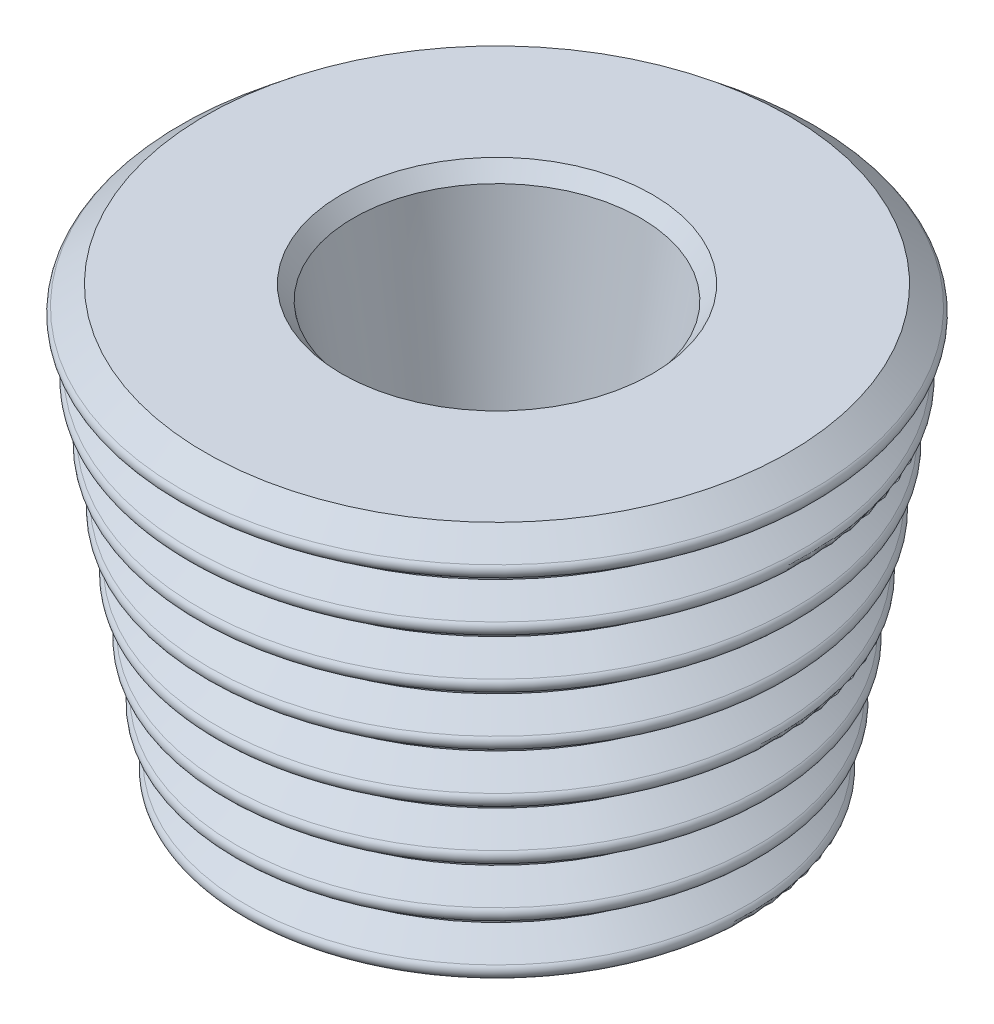
ISO-10303-21;
HEADER;
FILE_DESCRIPTION(('STEP AP214'),'2;1');
FILE_NAME('part.step','',(''),(''),'','','');
FILE_SCHEMA(('AUTOMOTIVE_DESIGN { 1 0 10303 214 1 1 1 1 }'));
ENDSEC;
DATA;
#1=APPLICATION_CONTEXT('core data for automotive mechanical design processes');
#2=APPLICATION_PROTOCOL_DEFINITION('international standard','automotive_design',2000,#1);
#3=PRODUCT_CONTEXT('',#1,'mechanical');
#4=PRODUCT('Part','Part','',(#3));
#5=PRODUCT_RELATED_PRODUCT_CATEGORY('part','',(#4));
#6=PRODUCT_DEFINITION_FORMATION('','',#4);
#7=PRODUCT_DEFINITION_CONTEXT('part definition',#1,'design');
#8=PRODUCT_DEFINITION('design','',#6,#7);
#9=PRODUCT_DEFINITION_SHAPE('','',#8);
#10=(LENGTH_UNIT() NAMED_UNIT(*) SI_UNIT(.MILLI.,.METRE.));
#11=(NAMED_UNIT(*) PLANE_ANGLE_UNIT() SI_UNIT($,.RADIAN.));
#12=(NAMED_UNIT(*) SI_UNIT($,.STERADIAN.) SOLID_ANGLE_UNIT());
#13=UNCERTAINTY_MEASURE_WITH_UNIT(LENGTH_MEASURE(1.E-05),#10,'distance_accuracy_value','');
#14=(GEOMETRIC_REPRESENTATION_CONTEXT(3) GLOBAL_UNCERTAINTY_ASSIGNED_CONTEXT((#13)) GLOBAL_UNIT_ASSIGNED_CONTEXT((#10,
#11,#12)) REPRESENTATION_CONTEXT('',''));
#15=CARTESIAN_POINT('',(0.,0.,0.));
#16=DIRECTION('',(0.,0.,1.));
#17=DIRECTION('',(1.,0.,0.));
#18=AXIS2_PLACEMENT_3D('',#15,#16,#17);
#19=CARTESIAN_POINT('',(0.,15.,0.));
#20=DIRECTION('',(0.,-1.,0.));
#21=DIRECTION('',(0.,0.,-1.));
#22=AXIS2_PLACEMENT_3D('',#19,#20,#21);
#23=PLANE('',#22);
#24=CARTESIAN_POINT('',(0.,15.,0.));
#25=DIRECTION('',(0.,-1.,0.));
#26=DIRECTION('',(0.,0.,-1.));
#27=AXIS2_PLACEMENT_3D('',#24,#25,#26);
#28=CIRCLE('',#27,5.32381628526827);
#29=CARTESIAN_POINT('',(0.,15.,-5.32381628526827));
#30=VERTEX_POINT('',#29);
#31=EDGE_CURVE('E55',#30,#30,#28,.T.);
#32=ORIENTED_EDGE('',*,*,#31,.T.);
#33=EDGE_LOOP('',(#32));
#34=FACE_BOUND('',#33,.T.);
#35=CARTESIAN_POINT('',(0.,15.,0.));
#36=DIRECTION('',(0.,-1.,0.));
#37=DIRECTION('',(0.,0.,-1.));
#38=AXIS2_PLACEMENT_3D('',#35,#36,#37);
#39=CIRCLE('',#38,10.);
#40=CARTESIAN_POINT('',(0.,15.,-10.));
#41=VERTEX_POINT('',#40);
#42=EDGE_CURVE('E156',#41,#41,#39,.T.);
#43=ORIENTED_EDGE('',*,*,#42,.F.);
#44=EDGE_LOOP('',(#43));
#45=FACE_BOUND('',#44,.T.);
#46=ADVANCED_FACE('F39',(#34,#45),#23,.F.);
#47=CARTESIAN_POINT('',(0.,0.,0.));
#48=DIRECTION('',(0.,1.,0.));
#49=DIRECTION('',(0.,0.,1.));
#50=AXIS2_PLACEMENT_3D('',#47,#48,#49);
#51=CONICAL_SURFACE('',#50,2.5,0.165148677414627);
#52=CARTESIAN_POINT('',(0.,0.214285714285721,0.));
#53=DIRECTION('',(0.,1.,0.));
#54=DIRECTION('',(0.,0.,1.));
#55=AXIS2_PLACEMENT_3D('',#52,#53,#54);
#56=CIRCLE('',#55,2.53571428571429);
#57=CARTESIAN_POINT('',(0.,0.214285714285721,2.53571428571429));
#58=VERTEX_POINT('',#57);
#59=EDGE_CURVE('E47',#58,#58,#56,.F.);
#60=ORIENTED_EDGE('',*,*,#59,.T.);
#61=EDGE_LOOP('',(#60));
#62=FACE_BOUND('',#61,.T.);
#63=CARTESIAN_POINT('',(0.,14.506803038084,0.));
#64=DIRECTION('',(0.,-1.,0.));
#65=DIRECTION('',(0.,0.,-1.));
#66=AXIS2_PLACEMENT_3D('',#63,#64,#65);
#67=CIRCLE('',#66,4.91780050634732);
#68=CARTESIAN_POINT('',(0.,14.506803038084,-4.91780050634732));
#69=VERTEX_POINT('',#68);
#70=EDGE_CURVE('E51',#69,#69,#67,.F.);
#71=ORIENTED_EDGE('',*,*,#70,.T.);
#72=EDGE_LOOP('',(#71));
#73=FACE_BOUND('',#72,.T.);
#74=ADVANCED_FACE('F163',(#62,#73),#51,.F.);
#75=CARTESIAN_POINT('',(0.,0.,0.));
#76=DIRECTION('',(0.,-1.,0.));
#77=DIRECTION('',(0.,0.,-1.));
#78=AXIS2_PLACEMENT_3D('',#75,#76,#77);
#79=PLANE('',#78);
#80=CARTESIAN_POINT('',(0.,0.,0.));
#81=DIRECTION('',(0.,-1.,0.));
#82=DIRECTION('',(0.,0.,-1.));
#83=AXIS2_PLACEMENT_3D('',#80,#81,#82);
#84=CIRCLE('',#83,2.75000000000001);
#85=CARTESIAN_POINT('',(0.,0.,-2.75000000000001));
#86=VERTEX_POINT('',#85);
#87=EDGE_CURVE('E10',#86,#86,#84,.F.);
#88=ORIENTED_EDGE('',*,*,#87,.T.);
#89=EDGE_LOOP('',(#88));
#90=FACE_BOUND('',#89,.T.);
#91=CARTESIAN_POINT('',(0.,0.,0.));
#92=DIRECTION('',(0.,-1.,0.));
#93=DIRECTION('',(0.,0.,-1.));
#94=AXIS2_PLACEMENT_3D('',#91,#92,#93);
#95=CIRCLE('',#94,7.5);
#96=CARTESIAN_POINT('',(0.,0.,-7.5));
#97=VERTEX_POINT('',#96);
#98=EDGE_CURVE('E60',#97,#97,#95,.T.);
#99=ORIENTED_EDGE('',*,*,#98,.T.);
#100=EDGE_LOOP('',(#99));
#101=FACE_BOUND('',#100,.T.);
#102=ADVANCED_FACE('F169',(#90,#101),#79,.T.);
#103=CARTESIAN_POINT('',(0.,0.,0.));
#104=DIRECTION('',(0.,1.,0.));
#105=DIRECTION('',(0.,0.,1.));
#106=AXIS2_PLACEMENT_3D('',#103,#104,#105);
#107=CONICAL_SURFACE('',#106,7.5,0.165148677414648);
#108=CARTESIAN_POINT('',(0.,0.0561320539430133,0.));
#109=DIRECTION('',(0.,-1.,0.));
#110=DIRECTION('',(0.,0.,-1.));
#111=AXIS2_PLACEMENT_3D('',#108,#109,#110);
#112=CIRCLE('',#111,7.50935534232384);
#113=CARTESIAN_POINT('',(0.,0.0561320539430133,-7.50935534232384));
#114=VERTEX_POINT('',#113);
#115=EDGE_CURVE('E63',#114,#114,#112,.T.);
#116=ORIENTED_EDGE('',*,*,#115,.T.);
#117=EDGE_LOOP('',(#116));
#118=FACE_BOUND('',#117,.T.);
#119=ORIENTED_EDGE('',*,*,#98,.F.);
#120=EDGE_LOOP('',(#119));
#121=FACE_BOUND('',#120,.T.);
#122=ADVANCED_FACE('F312',(#118,#121),#107,.T.);
#123=CARTESIAN_POINT('',(0.,0.430456018968015,0.));
#124=DIRECTION('',(0.,1.,0.));
#125=DIRECTION('',(0.,0.,1.));
#126=AXIS2_PLACEMENT_3D('',#123,#124,#125);
#127=CONICAL_SURFACE('',#126,8.50852673079096,1.21234622861122);
#128=ORIENTED_EDGE('',*,*,#115,.F.);
#129=EDGE_LOOP('',(#128));
#130=FACE_BOUND('',#129,.T.);
#131=CARTESIAN_POINT('',(0.,0.430456018968015,0.));
#132=DIRECTION('',(0.,-1.,0.));
#133=DIRECTION('',(0.,0.,-1.));
#134=AXIS2_PLACEMENT_3D('',#131,#132,#133);
#135=CIRCLE('',#134,8.50852673079096);
#136=CARTESIAN_POINT('',(0.,0.430456018968015,-8.50852673079096));
#137=VERTEX_POINT('',#136);
#138=EDGE_CURVE('E66',#137,#137,#135,.T.);
#139=ORIENTED_EDGE('',*,*,#138,.T.);
#140=EDGE_LOOP('',(#139));
#141=FACE_BOUND('',#140,.T.);
#142=ADVANCED_FACE('F308',(#130,#141),#127,.T.);
#143=CARTESIAN_POINT('',(0.,0.664566441425487,0.));
#144=DIRECTION('',(0.,-1.,0.));
#145=DIRECTION('',(0.,0.,-1.));
#146=AXIS2_PLACEMENT_3D('',#143,#144,#145);
#147=TOROIDAL_SURFACE('',#146,8.42082091515266,0.25);
#148=CARTESIAN_POINT('',(0.,0.857577117056638,0.));
#149=DIRECTION('',(0.,-1.,0.));
#150=DIRECTION('',(0.,0.,-1.));
#151=AXIS2_PLACEMENT_3D('',#148,#149,#150);
#152=CIRCLE('',#151,8.5797135804724);
#153=CARTESIAN_POINT('',(0.,0.857577117056638,-8.5797135804724));
#154=VERTEX_POINT('',#153);
#155=EDGE_CURVE('E69',#154,#154,#152,.T.);
#156=ORIENTED_EDGE('',*,*,#155,.T.);
#157=EDGE_LOOP('',(#156));
#158=FACE_BOUND('',#157,.T.);
#159=ORIENTED_EDGE('',*,*,#138,.F.);
#160=EDGE_LOOP('',(#159));
#161=FACE_BOUND('',#160,.T.);
#162=ADVANCED_FACE('F304',(#158,#161),#147,.T.);
#163=CARTESIAN_POINT('',(0.,1.53572293969124,0.));
#164=DIRECTION('',(0.,-1.,0.));
#165=DIRECTION('',(0.,0.,-1.));
#166=AXIS2_PLACEMENT_3D('',#163,#164,#165);
#167=CONICAL_SURFACE('',#166,7.75595382328187,0.882048873781965);
#168=ORIENTED_EDGE('',*,*,#155,.F.);
#169=EDGE_LOOP('',(#168));
#170=FACE_BOUND('',#169,.T.);
#171=CARTESIAN_POINT('',(0.,1.53572293969124,0.));
#172=DIRECTION('',(0.,-1.,0.));
#173=DIRECTION('',(0.,0.,-1.));
#174=AXIS2_PLACEMENT_3D('',#171,#172,#173);
#175=CIRCLE('',#174,7.75595382328187);
#176=CARTESIAN_POINT('',(0.,1.53572293969124,-7.75595382328187));
#177=VERTEX_POINT('',#176);
#178=EDGE_CURVE('E72',#177,#177,#175,.T.);
#179=ORIENTED_EDGE('',*,*,#178,.T.);
#180=EDGE_LOOP('',(#179));
#181=FACE_BOUND('',#180,.T.);
#182=ADVANCED_FACE('F300',(#170,#181),#167,.T.);
#183=CARTESIAN_POINT('',(0.,1.53572293969124,0.));
#184=DIRECTION('',(0.,1.,0.));
#185=DIRECTION('',(0.,0.,1.));
#186=AXIS2_PLACEMENT_3D('',#183,#184,#185);
#187=CONICAL_SURFACE('',#186,7.75595382328187,0.165148677414625);
#188=CARTESIAN_POINT('',(0.,1.97960020541569,0.));
#189=DIRECTION('',(0.,-1.,0.));
#190=DIRECTION('',(0.,0.,-1.));
#191=AXIS2_PLACEMENT_3D('',#188,#189,#190);
#192=CIRCLE('',#191,7.82993336756928);
#193=CARTESIAN_POINT('',(0.,1.97960020541569,-7.82993336756928));
#194=VERTEX_POINT('',#193);
#195=EDGE_CURVE('E75',#194,#194,#192,.T.);
#196=ORIENTED_EDGE('',*,*,#195,.T.);
#197=EDGE_LOOP('',(#196));
#198=FACE_BOUND('',#197,.T.);
#199=ORIENTED_EDGE('',*,*,#178,.F.);
#200=EDGE_LOOP('',(#199));
#201=FACE_BOUND('',#200,.T.);
#202=ADVANCED_FACE('F296',(#198,#201),#187,.T.);
#203=CARTESIAN_POINT('',(0.,2.35392417044069,0.));
#204=DIRECTION('',(0.,1.,0.));
#205=DIRECTION('',(0.,0.,1.));
#206=AXIS2_PLACEMENT_3D('',#203,#204,#205);
#207=CONICAL_SURFACE('',#206,8.82910475603641,1.21234622861122);
#208=ORIENTED_EDGE('',*,*,#195,.F.);
#209=EDGE_LOOP('',(#208));
#210=FACE_BOUND('',#209,.T.);
#211=CARTESIAN_POINT('',(0.,2.35392417044069,0.));
#212=DIRECTION('',(0.,-1.,0.));
#213=DIRECTION('',(0.,0.,-1.));
#214=AXIS2_PLACEMENT_3D('',#211,#212,#213);
#215=CIRCLE('',#214,8.82910475603641);
#216=CARTESIAN_POINT('',(0.,2.35392417044069,-8.82910475603641));
#217=VERTEX_POINT('',#216);
#218=EDGE_CURVE('E78',#217,#217,#215,.T.);
#219=ORIENTED_EDGE('',*,*,#218,.T.);
#220=EDGE_LOOP('',(#219));
#221=FACE_BOUND('',#220,.T.);
#222=ADVANCED_FACE('F292',(#210,#221),#207,.T.);
#223=CARTESIAN_POINT('',(0.,2.58803459289817,0.));
#224=DIRECTION('',(0.,-1.,0.));
#225=DIRECTION('',(0.,0.,-1.));
#226=AXIS2_PLACEMENT_3D('',#223,#224,#225);
#227=TOROIDAL_SURFACE('',#226,8.7413989403981,0.250000000000002);
#228=CARTESIAN_POINT('',(0.,2.78104526852932,0.));
#229=DIRECTION('',(0.,-1.,0.));
#230=DIRECTION('',(0.,0.,-1.));
#231=AXIS2_PLACEMENT_3D('',#228,#229,#230);
#232=CIRCLE('',#231,8.90029160571784);
#233=CARTESIAN_POINT('',(0.,2.78104526852932,-8.90029160571784));
#234=VERTEX_POINT('',#233);
#235=EDGE_CURVE('E81',#234,#234,#232,.T.);
#236=ORIENTED_EDGE('',*,*,#235,.T.);
#237=EDGE_LOOP('',(#236));
#238=FACE_BOUND('',#237,.T.);
#239=ORIENTED_EDGE('',*,*,#218,.F.);
#240=EDGE_LOOP('',(#239));
#241=FACE_BOUND('',#240,.T.);
#242=ADVANCED_FACE('F288',(#238,#241),#227,.T.);
#243=CARTESIAN_POINT('',(0.,3.45919109116392,0.));
#244=DIRECTION('',(0.,-1.,0.));
#245=DIRECTION('',(0.,0.,-1.));
#246=AXIS2_PLACEMENT_3D('',#243,#244,#245);
#247=CONICAL_SURFACE('',#246,8.07653184852732,0.882048873781966);
#248=ORIENTED_EDGE('',*,*,#235,.F.);
#249=EDGE_LOOP('',(#248));
#250=FACE_BOUND('',#249,.T.);
#251=CARTESIAN_POINT('',(0.,3.45919109116392,0.));
#252=DIRECTION('',(0.,-1.,0.));
#253=DIRECTION('',(0.,0.,-1.));
#254=AXIS2_PLACEMENT_3D('',#251,#252,#253);
#255=CIRCLE('',#254,8.07653184852732);
#256=CARTESIAN_POINT('',(0.,3.45919109116392,-8.07653184852732));
#257=VERTEX_POINT('',#256);
#258=EDGE_CURVE('E84',#257,#257,#255,.T.);
#259=ORIENTED_EDGE('',*,*,#258,.T.);
#260=EDGE_LOOP('',(#259));
#261=FACE_BOUND('',#260,.T.);
#262=ADVANCED_FACE('F284',(#250,#261),#247,.T.);
#263=CARTESIAN_POINT('',(0.,3.45919109116392,0.));
#264=DIRECTION('',(0.,1.,0.));
#265=DIRECTION('',(0.,0.,1.));
#266=AXIS2_PLACEMENT_3D('',#263,#264,#265);
#267=CONICAL_SURFACE('',#266,8.07653184852732,0.165148677414625);
#268=CARTESIAN_POINT('',(0.,3.90306835688837,0.));
#269=DIRECTION('',(0.,-1.,0.));
#270=DIRECTION('',(0.,0.,-1.));
#271=AXIS2_PLACEMENT_3D('',#268,#269,#270);
#272=CIRCLE('',#271,8.15051139281473);
#273=CARTESIAN_POINT('',(0.,3.90306835688837,-8.15051139281473));
#274=VERTEX_POINT('',#273);
#275=EDGE_CURVE('E87',#274,#274,#272,.T.);
#276=ORIENTED_EDGE('',*,*,#275,.T.);
#277=EDGE_LOOP('',(#276));
#278=FACE_BOUND('',#277,.T.);
#279=ORIENTED_EDGE('',*,*,#258,.F.);
#280=EDGE_LOOP('',(#279));
#281=FACE_BOUND('',#280,.T.);
#282=ADVANCED_FACE('F280',(#278,#281),#267,.T.);
#283=CARTESIAN_POINT('',(0.,4.27739232191337,0.));
#284=DIRECTION('',(0.,1.,0.));
#285=DIRECTION('',(0.,0.,1.));
#286=AXIS2_PLACEMENT_3D('',#283,#284,#285);
#287=CONICAL_SURFACE('',#286,9.14968278128185,1.21234622861122);
#288=ORIENTED_EDGE('',*,*,#275,.F.);
#289=EDGE_LOOP('',(#288));
#290=FACE_BOUND('',#289,.T.);
#291=CARTESIAN_POINT('',(0.,4.27739232191337,0.));
#292=DIRECTION('',(0.,-1.,0.));
#293=DIRECTION('',(0.,0.,-1.));
#294=AXIS2_PLACEMENT_3D('',#291,#292,#293);
#295=CIRCLE('',#294,9.14968278128185);
#296=CARTESIAN_POINT('',(0.,4.27739232191337,-9.14968278128185));
#297=VERTEX_POINT('',#296);
#298=EDGE_CURVE('E90',#297,#297,#295,.T.);
#299=ORIENTED_EDGE('',*,*,#298,.T.);
#300=EDGE_LOOP('',(#299));
#301=FACE_BOUND('',#300,.T.);
#302=ADVANCED_FACE('F276',(#290,#301),#287,.T.);
#303=CARTESIAN_POINT('',(0.,4.51150274437085,0.));
#304=DIRECTION('',(0.,-1.,0.));
#305=DIRECTION('',(0.,0.,-1.));
#306=AXIS2_PLACEMENT_3D('',#303,#304,#305);
#307=TOROIDAL_SURFACE('',#306,9.06197696564355,0.250000000000001);
#308=CARTESIAN_POINT('',(0.,4.704513420002,0.));
#309=DIRECTION('',(0.,-1.,0.));
#310=DIRECTION('',(0.,0.,-1.));
#311=AXIS2_PLACEMENT_3D('',#308,#309,#310);
#312=CIRCLE('',#311,9.22086963096329);
#313=CARTESIAN_POINT('',(0.,4.704513420002,-9.22086963096329));
#314=VERTEX_POINT('',#313);
#315=EDGE_CURVE('E93',#314,#314,#312,.T.);
#316=ORIENTED_EDGE('',*,*,#315,.T.);
#317=EDGE_LOOP('',(#316));
#318=FACE_BOUND('',#317,.T.);
#319=ORIENTED_EDGE('',*,*,#298,.F.);
#320=EDGE_LOOP('',(#319));
#321=FACE_BOUND('',#320,.T.);
#322=ADVANCED_FACE('F272',(#318,#321),#307,.T.);
#323=CARTESIAN_POINT('',(0.,5.38265924263661,0.));
#324=DIRECTION('',(0.,-1.,0.));
#325=DIRECTION('',(0.,0.,-1.));
#326=AXIS2_PLACEMENT_3D('',#323,#324,#325);
#327=CONICAL_SURFACE('',#326,8.39710987377277,0.882048873781967);
#328=ORIENTED_EDGE('',*,*,#315,.F.);
#329=EDGE_LOOP('',(#328));
#330=FACE_BOUND('',#329,.T.);
#331=CARTESIAN_POINT('',(0.,5.38265924263661,0.));
#332=DIRECTION('',(0.,-1.,0.));
#333=DIRECTION('',(0.,0.,-1.));
#334=AXIS2_PLACEMENT_3D('',#331,#332,#333);
#335=CIRCLE('',#334,8.39710987377277);
#336=CARTESIAN_POINT('',(0.,5.38265924263661,-8.39710987377277));
#337=VERTEX_POINT('',#336);
#338=EDGE_CURVE('E96',#337,#337,#335,.T.);
#339=ORIENTED_EDGE('',*,*,#338,.T.);
#340=EDGE_LOOP('',(#339));
#341=FACE_BOUND('',#340,.T.);
#342=ADVANCED_FACE('F268',(#330,#341),#327,.T.);
#343=CARTESIAN_POINT('',(0.,5.38265924263661,0.));
#344=DIRECTION('',(0.,1.,0.));
#345=DIRECTION('',(0.,0.,1.));
#346=AXIS2_PLACEMENT_3D('',#343,#344,#345);
#347=CONICAL_SURFACE('',#346,8.39710987377277,0.165148677414625);
#348=CARTESIAN_POINT('',(0.,5.82653650836105,0.));
#349=DIRECTION('',(0.,-1.,0.));
#350=DIRECTION('',(0.,0.,-1.));
#351=AXIS2_PLACEMENT_3D('',#348,#349,#350);
#352=CIRCLE('',#351,8.47108941806017);
#353=CARTESIAN_POINT('',(0.,5.82653650836105,-8.47108941806017));
#354=VERTEX_POINT('',#353);
#355=EDGE_CURVE('E99',#354,#354,#352,.T.);
#356=ORIENTED_EDGE('',*,*,#355,.T.);
#357=EDGE_LOOP('',(#356));
#358=FACE_BOUND('',#357,.T.);
#359=ORIENTED_EDGE('',*,*,#338,.F.);
#360=EDGE_LOOP('',(#359));
#361=FACE_BOUND('',#360,.T.);
#362=ADVANCED_FACE('F264',(#358,#361),#347,.T.);
#363=CARTESIAN_POINT('',(0.,6.20086047338605,0.));
#364=DIRECTION('',(0.,1.,0.));
#365=DIRECTION('',(0.,0.,1.));
#366=AXIS2_PLACEMENT_3D('',#363,#364,#365);
#367=CONICAL_SURFACE('',#366,9.4702608065273,1.21234622861122);
#368=ORIENTED_EDGE('',*,*,#355,.F.);
#369=EDGE_LOOP('',(#368));
#370=FACE_BOUND('',#369,.T.);
#371=CARTESIAN_POINT('',(0.,6.20086047338605,0.));
#372=DIRECTION('',(0.,-1.,0.));
#373=DIRECTION('',(0.,0.,-1.));
#374=AXIS2_PLACEMENT_3D('',#371,#372,#373);
#375=CIRCLE('',#374,9.4702608065273);
#376=CARTESIAN_POINT('',(0.,6.20086047338605,-9.4702608065273));
#377=VERTEX_POINT('',#376);
#378=EDGE_CURVE('E102',#377,#377,#375,.T.);
#379=ORIENTED_EDGE('',*,*,#378,.T.);
#380=EDGE_LOOP('',(#379));
#381=FACE_BOUND('',#380,.T.);
#382=ADVANCED_FACE('F260',(#370,#381),#367,.T.);
#383=CARTESIAN_POINT('',(0.,6.43497089584353,0.));
#384=DIRECTION('',(0.,-1.,0.));
#385=DIRECTION('',(0.,0.,-1.));
#386=AXIS2_PLACEMENT_3D('',#383,#384,#385);
#387=TOROIDAL_SURFACE('',#386,9.382554990889,0.25);
#388=CARTESIAN_POINT('',(0.,6.62798157147467,0.));
#389=DIRECTION('',(0.,-1.,0.));
#390=DIRECTION('',(0.,0.,-1.));
#391=AXIS2_PLACEMENT_3D('',#388,#389,#390);
#392=CIRCLE('',#391,9.54144765620874);
#393=CARTESIAN_POINT('',(0.,6.62798157147467,-9.54144765620874));
#394=VERTEX_POINT('',#393);
#395=EDGE_CURVE('E105',#394,#394,#392,.T.);
#396=ORIENTED_EDGE('',*,*,#395,.T.);
#397=EDGE_LOOP('',(#396));
#398=FACE_BOUND('',#397,.T.);
#399=ORIENTED_EDGE('',*,*,#378,.F.);
#400=EDGE_LOOP('',(#399));
#401=FACE_BOUND('',#400,.T.);
#402=ADVANCED_FACE('F256',(#398,#401),#387,.T.);
#403=CARTESIAN_POINT('',(0.,7.30612739410928,0.));
#404=DIRECTION('',(0.,-1.,0.));
#405=DIRECTION('',(0.,0.,-1.));
#406=AXIS2_PLACEMENT_3D('',#403,#404,#405);
#407=CONICAL_SURFACE('',#406,8.71768789901821,0.882048873781969);
#408=ORIENTED_EDGE('',*,*,#395,.F.);
#409=EDGE_LOOP('',(#408));
#410=FACE_BOUND('',#409,.T.);
#411=CARTESIAN_POINT('',(0.,7.30612739410928,0.));
#412=DIRECTION('',(0.,-1.,0.));
#413=DIRECTION('',(0.,0.,-1.));
#414=AXIS2_PLACEMENT_3D('',#411,#412,#413);
#415=CIRCLE('',#414,8.71768789901821);
#416=CARTESIAN_POINT('',(0.,7.30612739410928,-8.71768789901821));
#417=VERTEX_POINT('',#416);
#418=EDGE_CURVE('E108',#417,#417,#415,.T.);
#419=ORIENTED_EDGE('',*,*,#418,.T.);
#420=EDGE_LOOP('',(#419));
#421=FACE_BOUND('',#420,.T.);
#422=ADVANCED_FACE('F252',(#410,#421),#407,.T.);
#423=CARTESIAN_POINT('',(0.,7.30612739410928,0.));
#424=DIRECTION('',(0.,1.,0.));
#425=DIRECTION('',(0.,0.,1.));
#426=AXIS2_PLACEMENT_3D('',#423,#424,#425);
#427=CONICAL_SURFACE('',#426,8.71768789901821,0.165148677414627);
#428=CARTESIAN_POINT('',(0.,7.75000465983373,0.));
#429=DIRECTION('',(0.,-1.,0.));
#430=DIRECTION('',(0.,0.,-1.));
#431=AXIS2_PLACEMENT_3D('',#428,#429,#430);
#432=CIRCLE('',#431,8.79166744330562);
#433=CARTESIAN_POINT('',(0.,7.75000465983373,-8.79166744330562));
#434=VERTEX_POINT('',#433);
#435=EDGE_CURVE('E111',#434,#434,#432,.T.);
#436=ORIENTED_EDGE('',*,*,#435,.T.);
#437=EDGE_LOOP('',(#436));
#438=FACE_BOUND('',#437,.T.);
#439=ORIENTED_EDGE('',*,*,#418,.F.);
#440=EDGE_LOOP('',(#439));
#441=FACE_BOUND('',#440,.T.);
#442=ADVANCED_FACE('F248',(#438,#441),#427,.T.);
#443=CARTESIAN_POINT('',(0.,8.12432862485873,0.));
#444=DIRECTION('',(0.,1.,0.));
#445=DIRECTION('',(0.,0.,1.));
#446=AXIS2_PLACEMENT_3D('',#443,#444,#445);
#447=CONICAL_SURFACE('',#446,9.79083883177274,1.21234622861122);
#448=ORIENTED_EDGE('',*,*,#435,.F.);
#449=EDGE_LOOP('',(#448));
#450=FACE_BOUND('',#449,.T.);
#451=CARTESIAN_POINT('',(0.,8.12432862485873,0.));
#452=DIRECTION('',(0.,-1.,0.));
#453=DIRECTION('',(0.,0.,-1.));
#454=AXIS2_PLACEMENT_3D('',#451,#452,#453);
#455=CIRCLE('',#454,9.79083883177274);
#456=CARTESIAN_POINT('',(0.,8.12432862485873,-9.79083883177274));
#457=VERTEX_POINT('',#456);
#458=EDGE_CURVE('E114',#457,#457,#455,.T.);
#459=ORIENTED_EDGE('',*,*,#458,.T.);
#460=EDGE_LOOP('',(#459));
#461=FACE_BOUND('',#460,.T.);
#462=ADVANCED_FACE('F244',(#450,#461),#447,.T.);
#463=CARTESIAN_POINT('',(0.,8.35843904731621,0.));
#464=DIRECTION('',(0.,-1.,0.));
#465=DIRECTION('',(0.,0.,-1.));
#466=AXIS2_PLACEMENT_3D('',#463,#464,#465);
#467=TOROIDAL_SURFACE('',#466,9.70313301613444,0.249999999999999);
#468=CARTESIAN_POINT('',(0.,8.55144972294735,0.));
#469=DIRECTION('',(0.,-1.,0.));
#470=DIRECTION('',(0.,0.,-1.));
#471=AXIS2_PLACEMENT_3D('',#468,#469,#470);
#472=CIRCLE('',#471,9.86202568145418);
#473=CARTESIAN_POINT('',(0.,8.55144972294735,-9.86202568145418));
#474=VERTEX_POINT('',#473);
#475=EDGE_CURVE('E117',#474,#474,#472,.T.);
#476=ORIENTED_EDGE('',*,*,#475,.T.);
#477=EDGE_LOOP('',(#476));
#478=FACE_BOUND('',#477,.T.);
#479=ORIENTED_EDGE('',*,*,#458,.F.);
#480=EDGE_LOOP('',(#479));
#481=FACE_BOUND('',#480,.T.);
#482=ADVANCED_FACE('F240',(#478,#481),#467,.T.);
#483=CARTESIAN_POINT('',(0.,9.22959554558196,0.));
#484=DIRECTION('',(0.,-1.,0.));
#485=DIRECTION('',(0.,0.,-1.));
#486=AXIS2_PLACEMENT_3D('',#483,#484,#485);
#487=CONICAL_SURFACE('',#486,9.03826592426366,0.882048873781968);
#488=ORIENTED_EDGE('',*,*,#475,.F.);
#489=EDGE_LOOP('',(#488));
#490=FACE_BOUND('',#489,.T.);
#491=CARTESIAN_POINT('',(0.,9.22959554558196,0.));
#492=DIRECTION('',(0.,-1.,0.));
#493=DIRECTION('',(0.,0.,-1.));
#494=AXIS2_PLACEMENT_3D('',#491,#492,#493);
#495=CIRCLE('',#494,9.03826592426366);
#496=CARTESIAN_POINT('',(0.,9.22959554558196,-9.03826592426366));
#497=VERTEX_POINT('',#496);
#498=EDGE_CURVE('E120',#497,#497,#495,.T.);
#499=ORIENTED_EDGE('',*,*,#498,.T.);
#500=EDGE_LOOP('',(#499));
#501=FACE_BOUND('',#500,.T.);
#502=ADVANCED_FACE('F236',(#490,#501),#487,.T.);
#503=CARTESIAN_POINT('',(0.,9.22959554558196,0.));
#504=DIRECTION('',(0.,1.,0.));
#505=DIRECTION('',(0.,0.,1.));
#506=AXIS2_PLACEMENT_3D('',#503,#504,#505);
#507=CONICAL_SURFACE('',#506,9.03826592426366,0.165148677414622);
#508=CARTESIAN_POINT('',(0.,9.6734728113064,0.));
#509=DIRECTION('',(0.,-1.,0.));
#510=DIRECTION('',(0.,0.,-1.));
#511=AXIS2_PLACEMENT_3D('',#508,#509,#510);
#512=CIRCLE('',#511,9.11224546855106);
#513=CARTESIAN_POINT('',(0.,9.6734728113064,-9.11224546855106));
#514=VERTEX_POINT('',#513);
#515=EDGE_CURVE('E123',#514,#514,#512,.T.);
#516=ORIENTED_EDGE('',*,*,#515,.T.);
#517=EDGE_LOOP('',(#516));
#518=FACE_BOUND('',#517,.T.);
#519=ORIENTED_EDGE('',*,*,#498,.F.);
#520=EDGE_LOOP('',(#519));
#521=FACE_BOUND('',#520,.T.);
#522=ADVANCED_FACE('F232',(#518,#521),#507,.T.);
#523=CARTESIAN_POINT('',(0.,10.0477967763314,0.));
#524=DIRECTION('',(0.,1.,0.));
#525=DIRECTION('',(0.,0.,1.));
#526=AXIS2_PLACEMENT_3D('',#523,#524,#525);
#527=CONICAL_SURFACE('',#526,10.1114168570182,1.21234622861122);
#528=ORIENTED_EDGE('',*,*,#515,.F.);
#529=EDGE_LOOP('',(#528));
#530=FACE_BOUND('',#529,.T.);
#531=CARTESIAN_POINT('',(0.,10.0477967763314,0.));
#532=DIRECTION('',(0.,-1.,0.));
#533=DIRECTION('',(0.,0.,-1.));
#534=AXIS2_PLACEMENT_3D('',#531,#532,#533);
#535=CIRCLE('',#534,10.1114168570182);
#536=CARTESIAN_POINT('',(0.,10.0477967763314,-10.1114168570182));
#537=VERTEX_POINT('',#536);
#538=EDGE_CURVE('E126',#537,#537,#535,.T.);
#539=ORIENTED_EDGE('',*,*,#538,.T.);
#540=EDGE_LOOP('',(#539));
#541=FACE_BOUND('',#540,.T.);
#542=ADVANCED_FACE('F228',(#530,#541),#527,.T.);
#543=CARTESIAN_POINT('',(0.,10.2819071987889,0.));
#544=DIRECTION('',(0.,-1.,0.));
#545=DIRECTION('',(0.,0.,-1.));
#546=AXIS2_PLACEMENT_3D('',#543,#544,#545);
#547=TOROIDAL_SURFACE('',#546,10.0237110413799,0.250000000000001);
#548=CARTESIAN_POINT('',(0.,10.47491787442,0.));
#549=DIRECTION('',(0.,-1.,0.));
#550=DIRECTION('',(0.,0.,-1.));
#551=AXIS2_PLACEMENT_3D('',#548,#549,#550);
#552=CIRCLE('',#551,10.1826037066996);
#553=CARTESIAN_POINT('',(0.,10.47491787442,-10.1826037066996));
#554=VERTEX_POINT('',#553);
#555=EDGE_CURVE('E129',#554,#554,#552,.T.);
#556=ORIENTED_EDGE('',*,*,#555,.T.);
#557=EDGE_LOOP('',(#556));
#558=FACE_BOUND('',#557,.T.);
#559=ORIENTED_EDGE('',*,*,#538,.F.);
#560=EDGE_LOOP('',(#559));
#561=FACE_BOUND('',#560,.T.);
#562=ADVANCED_FACE('F224',(#558,#561),#547,.T.);
#563=CARTESIAN_POINT('',(0.,11.1530636970546,0.));
#564=DIRECTION('',(0.,-1.,0.));
#565=DIRECTION('',(0.,0.,-1.));
#566=AXIS2_PLACEMENT_3D('',#563,#564,#565);
#567=CONICAL_SURFACE('',#566,9.35884394950911,0.882048873781966);
#568=ORIENTED_EDGE('',*,*,#555,.F.);
#569=EDGE_LOOP('',(#568));
#570=FACE_BOUND('',#569,.T.);
#571=CARTESIAN_POINT('',(0.,11.1530636970546,0.));
#572=DIRECTION('',(0.,-1.,0.));
#573=DIRECTION('',(0.,0.,-1.));
#574=AXIS2_PLACEMENT_3D('',#571,#572,#573);
#575=CIRCLE('',#574,9.35884394950911);
#576=CARTESIAN_POINT('',(0.,11.1530636970546,-9.35884394950911));
#577=VERTEX_POINT('',#576);
#578=EDGE_CURVE('E132',#577,#577,#575,.T.);
#579=ORIENTED_EDGE('',*,*,#578,.T.);
#580=EDGE_LOOP('',(#579));
#581=FACE_BOUND('',#580,.T.);
#582=ADVANCED_FACE('F220',(#570,#581),#567,.T.);
#583=CARTESIAN_POINT('',(0.,11.1530636970546,0.));
#584=DIRECTION('',(0.,1.,0.));
#585=DIRECTION('',(0.,0.,1.));
#586=AXIS2_PLACEMENT_3D('',#583,#584,#585);
#587=CONICAL_SURFACE('',#586,9.35884394950911,0.165148677414629);
#588=CARTESIAN_POINT('',(0.,11.5969409627791,0.));
#589=DIRECTION('',(0.,-1.,0.));
#590=DIRECTION('',(0.,0.,-1.));
#591=AXIS2_PLACEMENT_3D('',#588,#589,#590);
#592=CIRCLE('',#591,9.43282349379651);
#593=CARTESIAN_POINT('',(0.,11.5969409627791,-9.43282349379651));
#594=VERTEX_POINT('',#593);
#595=EDGE_CURVE('E135',#594,#594,#592,.T.);
#596=ORIENTED_EDGE('',*,*,#595,.T.);
#597=EDGE_LOOP('',(#596));
#598=FACE_BOUND('',#597,.T.);
#599=ORIENTED_EDGE('',*,*,#578,.F.);
#600=EDGE_LOOP('',(#599));
#601=FACE_BOUND('',#600,.T.);
#602=ADVANCED_FACE('F216',(#598,#601),#587,.T.);
#603=CARTESIAN_POINT('',(0.,11.9712649278041,0.));
#604=DIRECTION('',(0.,1.,0.));
#605=DIRECTION('',(0.,0.,1.));
#606=AXIS2_PLACEMENT_3D('',#603,#604,#605);
#607=CONICAL_SURFACE('',#606,10.4319948822636,1.21234622861122);
#608=ORIENTED_EDGE('',*,*,#595,.F.);
#609=EDGE_LOOP('',(#608));
#610=FACE_BOUND('',#609,.T.);
#611=CARTESIAN_POINT('',(0.,11.9712649278041,0.));
#612=DIRECTION('',(0.,-1.,0.));
#613=DIRECTION('',(0.,0.,-1.));
#614=AXIS2_PLACEMENT_3D('',#611,#612,#613);
#615=CIRCLE('',#614,10.4319948822636);
#616=CARTESIAN_POINT('',(0.,11.9712649278041,-10.4319948822636));
#617=VERTEX_POINT('',#616);
#618=EDGE_CURVE('E138',#617,#617,#615,.T.);
#619=ORIENTED_EDGE('',*,*,#618,.T.);
#620=EDGE_LOOP('',(#619));
#621=FACE_BOUND('',#620,.T.);
#622=ADVANCED_FACE('F212',(#610,#621),#607,.T.);
#623=CARTESIAN_POINT('',(0.,12.2053753502616,0.));
#624=DIRECTION('',(0.,-1.,0.));
#625=DIRECTION('',(0.,0.,-1.));
#626=AXIS2_PLACEMENT_3D('',#623,#624,#625);
#627=TOROIDAL_SURFACE('',#626,10.3442890666253,0.25);
#628=CARTESIAN_POINT('',(0.,12.3983860258927,0.));
#629=DIRECTION('',(0.,-1.,0.));
#630=DIRECTION('',(0.,0.,-1.));
#631=AXIS2_PLACEMENT_3D('',#628,#629,#630);
#632=CIRCLE('',#631,10.5031817319451);
#633=CARTESIAN_POINT('',(0.,12.3983860258927,-10.5031817319451));
#634=VERTEX_POINT('',#633);
#635=EDGE_CURVE('E141',#634,#634,#632,.T.);
#636=ORIENTED_EDGE('',*,*,#635,.T.);
#637=EDGE_LOOP('',(#636));
#638=FACE_BOUND('',#637,.T.);
#639=ORIENTED_EDGE('',*,*,#618,.F.);
#640=EDGE_LOOP('',(#639));
#641=FACE_BOUND('',#640,.T.);
#642=ADVANCED_FACE('F208',(#638,#641),#627,.T.);
#643=CARTESIAN_POINT('',(0.,13.0765318485273,0.));
#644=DIRECTION('',(0.,-1.,0.));
#645=DIRECTION('',(0.,0.,-1.));
#646=AXIS2_PLACEMENT_3D('',#643,#644,#645);
#647=CONICAL_SURFACE('',#646,9.67942197475455,0.882048873781964);
#648=ORIENTED_EDGE('',*,*,#635,.F.);
#649=EDGE_LOOP('',(#648));
#650=FACE_BOUND('',#649,.T.);
#651=CARTESIAN_POINT('',(0.,13.0765318485273,0.));
#652=DIRECTION('',(0.,-1.,0.));
#653=DIRECTION('',(0.,0.,-1.));
#654=AXIS2_PLACEMENT_3D('',#651,#652,#653);
#655=CIRCLE('',#654,9.67942197475455);
#656=CARTESIAN_POINT('',(0.,13.0765318485273,-9.67942197475455));
#657=VERTEX_POINT('',#656);
#658=EDGE_CURVE('E144',#657,#657,#655,.T.);
#659=ORIENTED_EDGE('',*,*,#658,.T.);
#660=EDGE_LOOP('',(#659));
#661=FACE_BOUND('',#660,.T.);
#662=ADVANCED_FACE('F204',(#650,#661),#647,.T.);
#663=CARTESIAN_POINT('',(0.,13.0765318485273,0.));
#664=DIRECTION('',(0.,1.,0.));
#665=DIRECTION('',(0.,0.,1.));
#666=AXIS2_PLACEMENT_3D('',#663,#664,#665);
#667=CONICAL_SURFACE('',#666,9.67942197475455,0.165148677414628);
#668=CARTESIAN_POINT('',(0.,13.5204091142518,0.));
#669=DIRECTION('',(0.,-1.,0.));
#670=DIRECTION('',(0.,0.,-1.));
#671=AXIS2_PLACEMENT_3D('',#668,#669,#670);
#672=CIRCLE('',#671,9.75340151904196);
#673=CARTESIAN_POINT('',(0.,13.5204091142518,-9.75340151904196));
#674=VERTEX_POINT('',#673);
#675=EDGE_CURVE('E147',#674,#674,#672,.T.);
#676=ORIENTED_EDGE('',*,*,#675,.T.);
#677=EDGE_LOOP('',(#676));
#678=FACE_BOUND('',#677,.T.);
#679=ORIENTED_EDGE('',*,*,#658,.F.);
#680=EDGE_LOOP('',(#679));
#681=FACE_BOUND('',#680,.T.);
#682=ADVANCED_FACE('F200',(#678,#681),#667,.T.);
#683=CARTESIAN_POINT('',(0.,13.8947330792768,0.));
#684=DIRECTION('',(0.,1.,0.));
#685=DIRECTION('',(0.,0.,1.));
#686=AXIS2_PLACEMENT_3D('',#683,#684,#685);
#687=CONICAL_SURFACE('',#686,10.7525729075091,1.21234622861122);
#688=ORIENTED_EDGE('',*,*,#675,.F.);
#689=EDGE_LOOP('',(#688));
#690=FACE_BOUND('',#689,.T.);
#691=CARTESIAN_POINT('',(0.,13.8947330792768,0.));
#692=DIRECTION('',(0.,-1.,0.));
#693=DIRECTION('',(0.,0.,-1.));
#694=AXIS2_PLACEMENT_3D('',#691,#692,#693);
#695=CIRCLE('',#694,10.7525729075091);
#696=CARTESIAN_POINT('',(0.,13.8947330792768,-10.7525729075091));
#697=VERTEX_POINT('',#696);
#698=EDGE_CURVE('E150',#697,#697,#695,.T.);
#699=ORIENTED_EDGE('',*,*,#698,.T.);
#700=EDGE_LOOP('',(#699));
#701=FACE_BOUND('',#700,.T.);
#702=ADVANCED_FACE('F193',(#690,#701),#687,.T.);
#703=CARTESIAN_POINT('',(0.,14.1288435017342,0.));
#704=DIRECTION('',(0.,-1.,0.));
#705=DIRECTION('',(0.,0.,-1.));
#706=AXIS2_PLACEMENT_3D('',#703,#704,#705);
#707=TOROIDAL_SURFACE('',#706,10.6648670918708,0.25);
#708=ORIENTED_EDGE('',*,*,#698,.F.);
#709=EDGE_LOOP('',(#708));
#710=FACE_BOUND('',#709,.T.);
#711=CARTESIAN_POINT('',(0.,14.3218541773654,0.));
#712=DIRECTION('',(0.,-1.,0.));
#713=DIRECTION('',(0.,0.,-1.));
#714=AXIS2_PLACEMENT_3D('',#711,#712,#713);
#715=CIRCLE('',#714,10.8237597571905);
#716=CARTESIAN_POINT('',(0.,14.3218541773654,-10.8237597571905));
#717=VERTEX_POINT('',#716);
#718=EDGE_CURVE('E153',#717,#717,#715,.T.);
#719=ORIENTED_EDGE('',*,*,#718,.T.);
#720=EDGE_LOOP('',(#719));
#721=FACE_BOUND('',#720,.T.);
#722=ADVANCED_FACE('F183',(#710,#721),#707,.T.);
#723=CARTESIAN_POINT('',(0.,15.,0.));
#724=DIRECTION('',(0.,-1.,0.));
#725=DIRECTION('',(0.,0.,-1.));
#726=AXIS2_PLACEMENT_3D('',#723,#724,#725);
#727=CONICAL_SURFACE('',#726,10.,0.882048873781968);
#728=ORIENTED_EDGE('',*,*,#718,.F.);
#729=EDGE_LOOP('',(#728));
#730=FACE_BOUND('',#729,.T.);
#731=ORIENTED_EDGE('',*,*,#42,.T.);
#732=EDGE_LOOP('',(#731));
#733=FACE_BOUND('',#732,.T.);
#734=ADVANCED_FACE('F160',(#730,#733),#727,.T.);
#735=CARTESIAN_POINT('',(0.,15.,0.));
#736=DIRECTION('',(0.,1.,0.));
#737=DIRECTION('',(0.,0.,1.));
#738=AXIS2_PLACEMENT_3D('',#735,#736,#737);
#739=CONICAL_SURFACE('',#738,5.32381628526827,0.688747453012921);
#740=ORIENTED_EDGE('',*,*,#70,.F.);
#741=EDGE_LOOP('',(#740));
#742=FACE_BOUND('',#741,.T.);
#743=ORIENTED_EDGE('',*,*,#31,.F.);
#744=EDGE_LOOP('',(#743));
#745=FACE_BOUND('',#744,.T.);
#746=ADVANCED_FACE('F173',(#742,#745),#739,.F.);
#747=CARTESIAN_POINT('',(0.,0.214285714285721,0.));
#748=DIRECTION('',(0.,-1.,0.));
#749=DIRECTION('',(0.,0.,-1.));
#750=AXIS2_PLACEMENT_3D('',#747,#748,#749);
#751=CONICAL_SURFACE('',#750,2.53571428571429,0.785398163397447);
#752=ORIENTED_EDGE('',*,*,#87,.F.);
#753=EDGE_LOOP('',(#752));
#754=FACE_BOUND('',#753,.T.);
#755=ORIENTED_EDGE('',*,*,#59,.F.);
#756=EDGE_LOOP('',(#755));
#757=FACE_BOUND('',#756,.T.);
#758=ADVANCED_FACE('F42',(#754,#757),#751,.F.);
#759=CLOSED_SHELL('',(#46,#74,#102,#122,#142,#162,#182,#202,#222,#242,#262,#282,#302,#322,#342,
#362,#382,#402,#422,#442,#462,#482,#502,#522,#542,#562,#582,#602,#622,#642,#662,#682,#702,#722,
#734,#746,#758));
#760=MANIFOLD_SOLID_BREP('B2',#759);
#761=ADVANCED_BREP_SHAPE_REPRESENTATION('',(#18,#760),#14);
#762=SHAPE_DEFINITION_REPRESENTATION(#9,#761);
ENDSEC;
END-ISO-10303-21;
